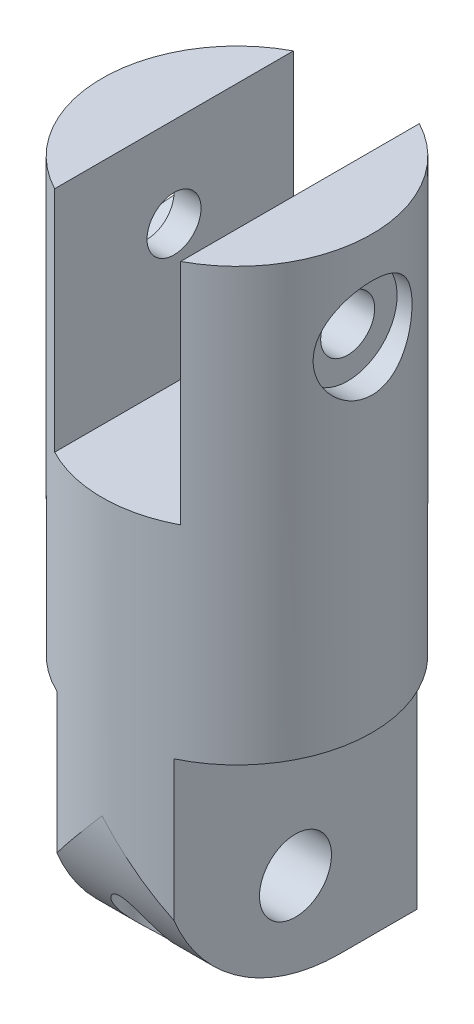
ISO-10303-21;
HEADER;
FILE_DESCRIPTION(('STEP AP214'),'2;1');
FILE_NAME('part.step','',(''),(''),'','','');
FILE_SCHEMA(('AUTOMOTIVE_DESIGN { 1 0 10303 214 1 1 1 1 }'));
ENDSEC;
DATA;
#1=APPLICATION_CONTEXT('core data for automotive mechanical design processes');
#2=APPLICATION_PROTOCOL_DEFINITION('international standard','automotive_design',2000,#1);
#3=PRODUCT_CONTEXT('',#1,'mechanical');
#4=PRODUCT('Part','Part','',(#3));
#5=PRODUCT_RELATED_PRODUCT_CATEGORY('part','',(#4));
#6=PRODUCT_DEFINITION_FORMATION('','',#4);
#7=PRODUCT_DEFINITION_CONTEXT('part definition',#1,'design');
#8=PRODUCT_DEFINITION('design','',#6,#7);
#9=PRODUCT_DEFINITION_SHAPE('','',#8);
#10=(LENGTH_UNIT() NAMED_UNIT(*) SI_UNIT(.MILLI.,.METRE.));
#11=(NAMED_UNIT(*) PLANE_ANGLE_UNIT() SI_UNIT($,.RADIAN.));
#12=(NAMED_UNIT(*) SI_UNIT($,.STERADIAN.) SOLID_ANGLE_UNIT());
#13=UNCERTAINTY_MEASURE_WITH_UNIT(LENGTH_MEASURE(1.E-05),#10,'distance_accuracy_value','');
#14=(GEOMETRIC_REPRESENTATION_CONTEXT(3) GLOBAL_UNCERTAINTY_ASSIGNED_CONTEXT((#13)) GLOBAL_UNIT_ASSIGNED_CONTEXT((#10,
#11,#12)) REPRESENTATION_CONTEXT('',''));
#15=CARTESIAN_POINT('',(0.,0.,0.));
#16=DIRECTION('',(0.,0.,1.));
#17=DIRECTION('',(1.,0.,0.));
#18=AXIS2_PLACEMENT_3D('',#15,#16,#17);
#19=CARTESIAN_POINT('',(3.25,7.,15.));
#20=DIRECTION('',(-1.,0.,0.));
#21=DIRECTION('',(0.,-1.,0.));
#22=AXIS2_PLACEMENT_3D('',#19,#20,#21);
#23=PLANE('',#22);
#24=CARTESIAN_POINT('',(3.25,-2.,7.5));
#25=DIRECTION('',(1.,0.,0.));
#26=DIRECTION('',(0.,1.,0.));
#27=AXIS2_PLACEMENT_3D('',#24,#25,#26);
#28=CIRCLE('',#27,2.);
#29=CARTESIAN_POINT('',(3.25,0.,7.5));
#30=VERTEX_POINT('',#29);
#31=EDGE_CURVE('E371',#30,#30,#28,.T.);
#32=ORIENTED_EDGE('',*,*,#31,.F.);
#33=EDGE_LOOP('',(#32));
#34=FACE_BOUND('',#33,.T.);
#35=DIRECTION('',(0.,1.,0.));
#36=VECTOR('',#35,1.);
#37=CARTESIAN_POINT('',(3.25,-7.,0.740747082702113));
#38=LINE('',#37,#36);
#39=CARTESIAN_POINT('',(3.25,-7.,0.740747082702113));
#40=VERTEX_POINT('',#39);
#41=CARTESIAN_POINT('',(3.25,7.,0.740747082702113));
#42=VERTEX_POINT('',#41);
#43=EDGE_CURVE('E242',#40,#42,#38,.T.);
#44=ORIENTED_EDGE('',*,*,#43,.T.);
#45=DIRECTION('',(0.,0.,-1.));
#46=VECTOR('',#45,1.);
#47=CARTESIAN_POINT('',(3.25,7.,15.));
#48=LINE('',#47,#46);
#49=CARTESIAN_POINT('',(3.25,7.,14.2592529172979));
#50=VERTEX_POINT('',#49);
#51=EDGE_CURVE('E389',#50,#42,#48,.T.);
#52=ORIENTED_EDGE('',*,*,#51,.F.);
#53=DIRECTION('',(0.,1.,0.));
#54=VECTOR('',#53,1.);
#55=CARTESIAN_POINT('',(3.25,-7.,14.2592529172979));
#56=LINE('',#55,#54);
#57=CARTESIAN_POINT('',(3.25,-0.777067038524808,14.2592529172979));
#58=VERTEX_POINT('',#57);
#59=EDGE_CURVE('E251',#58,#50,#56,.T.);
#60=ORIENTED_EDGE('',*,*,#59,.F.);
#61=CARTESIAN_POINT('',(3.25,3.,5.));
#62=DIRECTION('',(-1.,0.,0.));
#63=DIRECTION('',(0.,-1.,0.));
#64=AXIS2_PLACEMENT_3D('',#61,#62,#63);
#65=CIRCLE('',#64,10.);
#66=CARTESIAN_POINT('',(3.25,-7.,5.));
#67=VERTEX_POINT('',#66);
#68=EDGE_CURVE('E392',#58,#67,#65,.F.);
#69=ORIENTED_EDGE('',*,*,#68,.T.);
#70=DIRECTION('',(0.,0.,-1.));
#71=VECTOR('',#70,1.);
#72=CARTESIAN_POINT('',(3.25,-7.,15.));
#73=LINE('',#72,#71);
#74=EDGE_CURVE('E374',#67,#40,#73,.T.);
#75=ORIENTED_EDGE('',*,*,#74,.T.);
#76=EDGE_LOOP('',(#44,#52,#60,#69,#75));
#77=FACE_BOUND('',#76,.T.);
#78=ADVANCED_FACE('F70',(#34,#77),#23,.F.);
#79=CARTESIAN_POINT('',(-3.25,-7.,15.));
#80=DIRECTION('',(0.,1.,0.));
#81=DIRECTION('',(0.,0.,1.));
#82=AXIS2_PLACEMENT_3D('',#79,#80,#81);
#83=PLANE('',#82);
#84=CARTESIAN_POINT('',(0.,-7.,3.));
#85=DIRECTION('',(0.,-1.,0.));
#86=DIRECTION('',(0.,0.,-1.));
#87=AXIS2_PLACEMENT_3D('',#84,#85,#86);
#88=CIRCLE('',#87,1.25);
#89=CARTESIAN_POINT('',(0.,-7.,1.75));
#90=VERTEX_POINT('',#89);
#91=EDGE_CURVE('E213',#90,#90,#88,.T.);
#92=ORIENTED_EDGE('',*,*,#91,.F.);
#93=EDGE_LOOP('',(#92));
#94=FACE_BOUND('',#93,.T.);
#95=CARTESIAN_POINT('',(0.,-7.,7.5));
#96=DIRECTION('',(0.,1.,0.));
#97=DIRECTION('',(0.,0.,1.));
#98=AXIS2_PLACEMENT_3D('',#95,#96,#97);
#99=CIRCLE('',#98,7.5);
#100=CARTESIAN_POINT('',(-3.25,-7.,0.740747082702113));
#101=VERTEX_POINT('',#100);
#102=EDGE_CURVE('E252',#40,#101,#99,.T.);
#103=ORIENTED_EDGE('',*,*,#102,.F.);
#104=ORIENTED_EDGE('',*,*,#74,.F.);
#105=DIRECTION('',(1.,0.,0.));
#106=VECTOR('',#105,1.);
#107=CARTESIAN_POINT('',(-3.25,-7.,5.));
#108=LINE('',#107,#106);
#109=CARTESIAN_POINT('',(-3.25,-7.,5.));
#110=VERTEX_POINT('',#109);
#111=EDGE_CURVE('E394',#67,#110,#108,.F.);
#112=ORIENTED_EDGE('',*,*,#111,.T.);
#113=DIRECTION('',(0.,0.,-1.));
#114=VECTOR('',#113,1.);
#115=CARTESIAN_POINT('',(-3.25,-7.,15.));
#116=LINE('',#115,#114);
#117=EDGE_CURVE('E383',#110,#101,#116,.T.);
#118=ORIENTED_EDGE('',*,*,#117,.T.);
#119=EDGE_LOOP('',(#103,#104,#112,#118));
#120=FACE_BOUND('',#119,.T.);
#121=ADVANCED_FACE('F339',(#94,#120),#83,.F.);
#122=CARTESIAN_POINT('',(-3.25,7.,15.));
#123=DIRECTION('',(1.,0.,0.));
#124=DIRECTION('',(0.,1.,0.));
#125=AXIS2_PLACEMENT_3D('',#122,#123,#124);
#126=PLANE('',#125);
#127=CARTESIAN_POINT('',(-3.25,-2.,7.5));
#128=DIRECTION('',(1.,0.,0.));
#129=DIRECTION('',(0.,1.,0.));
#130=AXIS2_PLACEMENT_3D('',#127,#128,#129);
#131=CIRCLE('',#130,2.);
#132=CARTESIAN_POINT('',(-3.25,0.,7.5));
#133=VERTEX_POINT('',#132);
#134=EDGE_CURVE('E369',#133,#133,#131,.T.);
#135=ORIENTED_EDGE('',*,*,#134,.T.);
#136=EDGE_LOOP('',(#135));
#137=FACE_BOUND('',#136,.T.);
#138=CARTESIAN_POINT('',(-3.25,3.,5.));
#139=DIRECTION('',(1.,0.,0.));
#140=DIRECTION('',(0.,1.,0.));
#141=AXIS2_PLACEMENT_3D('',#138,#139,#140);
#142=CIRCLE('',#141,10.);
#143=CARTESIAN_POINT('',(-3.25,-0.777067038524727,14.2592529172979));
#144=VERTEX_POINT('',#143);
#145=EDGE_CURVE('E396',#110,#144,#142,.F.);
#146=ORIENTED_EDGE('',*,*,#145,.T.);
#147=DIRECTION('',(0.,1.,0.));
#148=VECTOR('',#147,1.);
#149=CARTESIAN_POINT('',(-3.25,-7.,14.2592529172979));
#150=LINE('',#149,#148);
#151=CARTESIAN_POINT('',(-3.25,7.,14.2592529172979));
#152=VERTEX_POINT('',#151);
#153=EDGE_CURVE('E240',#144,#152,#150,.T.);
#154=ORIENTED_EDGE('',*,*,#153,.T.);
#155=DIRECTION('',(0.,0.,-1.));
#156=VECTOR('',#155,1.);
#157=CARTESIAN_POINT('',(-3.25,7.,15.));
#158=LINE('',#157,#156);
#159=CARTESIAN_POINT('',(-3.25,7.,0.740747082702112));
#160=VERTEX_POINT('',#159);
#161=EDGE_CURVE('E386',#152,#160,#158,.T.);
#162=ORIENTED_EDGE('',*,*,#161,.T.);
#163=DIRECTION('',(0.,1.,0.));
#164=VECTOR('',#163,1.);
#165=CARTESIAN_POINT('',(-3.25,-7.,0.740747082702113));
#166=LINE('',#165,#164);
#167=EDGE_CURVE('E422',#101,#160,#166,.T.);
#168=ORIENTED_EDGE('',*,*,#167,.F.);
#169=ORIENTED_EDGE('',*,*,#117,.F.);
#170=EDGE_LOOP('',(#146,#154,#162,#168,#169));
#171=FACE_BOUND('',#170,.T.);
#172=ADVANCED_FACE('F344',(#137,#171),#126,.F.);
#173=CARTESIAN_POINT('',(0.,3.,5.));
#174=DIRECTION('',(-1.,0.,0.));
#175=DIRECTION('',(0.,0.,1.));
#176=AXIS2_PLACEMENT_3D('',#173,#174,#175);
#177=CYLINDRICAL_SURFACE('',#176,10.);
#178=CARTESIAN_POINT('',(0.,-4.60034588039679,11.4988262400479));
#179=CARTESIAN_POINT('',(0.0575288109608131,-4.60034633192946,11.4988256093035));
#180=CARTESIAN_POINT('',(0.11505399772144,-4.59693401826059,11.502822715136));
#181=CARTESIAN_POINT('',(0.22823665096081,-4.5834761227697,11.5185116248287));
#182=CARTESIAN_POINT('',(0.283893883210376,-4.57342971231711,11.5302043899131));
#183=CARTESIAN_POINT('',(0.391522903078539,-4.54727481070758,11.560414189299));
#184=CARTESIAN_POINT('',(0.443509328590721,-4.53119222670741,11.578902052222));
#185=CARTESIAN_POINT('',(0.542970946334787,-4.49367037095389,11.6216094500825));
#186=CARTESIAN_POINT('',(0.590444207603541,-4.47222882047104,11.6458314230352));
#187=CARTESIAN_POINT('',(0.693858382566063,-4.41754856445222,11.7068701017729));
#188=CARTESIAN_POINT('',(0.74800982895763,-4.38270365386441,11.7452795553846));
#189=CARTESIAN_POINT('',(0.847148183723735,-4.30681705487514,11.8274129335695));
#190=CARTESIAN_POINT('',(0.89211987702798,-4.26576527170702,11.8711454925512));
#191=CARTESIAN_POINT('',(0.987252420045894,-4.16367094789748,11.9777470851912));
#192=CARTESIAN_POINT('',(1.03375682534324,-4.10064843319519,12.0419724818224));
#193=CARTESIAN_POINT('',(1.11202550102491,-3.96841120618138,12.1728634669199));
#194=CARTESIAN_POINT('',(1.14376846925352,-3.89918771589937,12.2395324330415));
#195=CARTESIAN_POINT('',(1.20512691121574,-3.72575254744175,12.4015979723462));
#196=CARTESIAN_POINT('',(1.22801220853734,-3.61925054145639,12.4970726247963));
#197=CARTESIAN_POINT('',(1.25192625827192,-3.40072630611675,12.6845018482235));
#198=CARTESIAN_POINT('',(1.25290080853041,-3.28869107409675,12.7764471281507));
#199=CARTESIAN_POINT('',(1.2390160739484,-3.10025953801128,12.9243894094759));
#200=CARTESIAN_POINT('',(1.22941770428853,-3.02467078036612,12.9819973062648));
#201=CARTESIAN_POINT('',(1.20265869273446,-2.87271614168859,13.0944508219831));
#202=CARTESIAN_POINT('',(1.18549447992938,-2.79634991035228,13.1492951229198));
#203=CARTESIAN_POINT('',(1.14397630217485,-2.64352762751517,13.2558626611615));
#204=CARTESIAN_POINT('',(1.1196297934206,-2.56707175066068,13.3075890685247));
#205=CARTESIAN_POINT('',(1.0637867813495,-2.4146576671145,13.4077218470943));
#206=CARTESIAN_POINT('',(1.03229458006037,-2.33869918916016,13.4561301931831));
#207=CARTESIAN_POINT('',(0.959546911817907,-2.18327021358453,13.5523439188718));
#208=CARTESIAN_POINT('',(0.917797461428203,-2.10388405447856,13.5999146411363));
#209=CARTESIAN_POINT('',(0.824662482152894,-1.94813724713139,13.6904545809013));
#210=CARTESIAN_POINT('',(0.773285416874435,-1.87177401232619,13.7334277883316));
#211=CARTESIAN_POINT('',(0.676695759717014,-1.74841146843393,13.8009016608124));
#212=CARTESIAN_POINT('',(0.634678644034613,-1.69976793648386,13.8269441706631));
#213=CARTESIAN_POINT('',(0.543764619578198,-1.60733393640184,13.8755374312719));
#214=CARTESIAN_POINT('',(0.494882481116181,-1.56353340082824,13.8980954657454));
#215=CARTESIAN_POINT('',(0.410328609425263,-1.50057299344001,13.9300362657961));
#216=CARTESIAN_POINT('',(0.377364323238513,-1.47863442485303,13.9410472218018));
#217=CARTESIAN_POINT('',(0.308269866690451,-1.43908401630296,13.9607487164632));
#218=CARTESIAN_POINT('',(0.272144496533989,-1.42146576535685,13.9694426950006));
#219=CARTESIAN_POINT('',(0.204140015054733,-1.39500732552652,13.9824321515032));
#220=CARTESIAN_POINT('',(0.172770922493601,-1.38513258262856,13.9872509335304));
#221=CARTESIAN_POINT('',(0.10863906512088,-1.3702186469195,13.9945127413908));
#222=CARTESIAN_POINT('',(0.0758780804831299,-1.36517346082817,13.9969587118357));
#223=CARTESIAN_POINT('',(0.00971565662024547,-1.36049332526411,13.999228082882));
#224=CARTESIAN_POINT('',(-0.0236880276005255,-1.36088324321488,13.9990394291871));
#225=CARTESIAN_POINT('',(-0.0898697850396133,-1.36708221585887,13.9960326446625));
#226=CARTESIAN_POINT('',(-0.12264736944618,-1.37289534121178,13.9932125386644));
#227=CARTESIAN_POINT('',(-0.192498993484608,-1.39076317365085,13.9845039818664));
#228=CARTESIAN_POINT('',(-0.229268404492208,-1.40376175841571,13.9781502759771));
#229=CARTESIAN_POINT('',(-0.299995279155415,-1.43484740134685,13.9628359879126));
#230=CARTESIAN_POINT('',(-0.333946810007977,-1.45294485968761,13.9538700763329));
#231=CARTESIAN_POINT('',(-0.418925600500643,-1.50503533887645,13.9278178923304));
#232=CARTESIAN_POINT('',(-0.467632638347218,-1.54196424707584,13.909126433341));
#233=CARTESIAN_POINT('',(-0.558564300251688,-1.62136560507975,13.8682014347293));
#234=CARTESIAN_POINT('',(-0.600770050090257,-1.66385355695524,13.8459579501095));
#235=CARTESIAN_POINT('',(-0.678801636651221,-1.75107385940053,13.799413769684));
#236=CARTESIAN_POINT('',(-0.714760353406768,-1.79572378952148,13.7751782289425));
#237=CARTESIAN_POINT('',(-0.782368998157438,-1.88709197799037,13.724624021988));
#238=CARTESIAN_POINT('',(-0.814015009233281,-1.93381206615915,13.6983034959845));
#239=CARTESIAN_POINT('',(-0.873578262146656,-2.02867607236967,13.6438079702081));
#240=CARTESIAN_POINT('',(-0.901487844310031,-2.07682267540891,13.6156293325072));
#241=CARTESIAN_POINT('',(-0.953869165706419,-2.17399414365024,13.5576276254842));
#242=CARTESIAN_POINT('',(-0.978339944562463,-2.22301924990456,13.5278041000089));
#243=CARTESIAN_POINT('',(-1.03648457622005,-2.34837571239289,13.4500224067966));
#244=CARTESIAN_POINT('',(-1.06794492165718,-2.42508593896396,13.4010069487532));
#245=CARTESIAN_POINT('',(-1.12359720816828,-2.57896430130894,13.2996181391025));
#246=CARTESIAN_POINT('',(-1.14778503835172,-2.65613267101885,13.2472429085551));
#247=CARTESIAN_POINT('',(-1.18880186967856,-2.81020378415608,13.1394324196061));
#248=CARTESIAN_POINT('',(-1.2056368062501,-2.8871066919307,13.0839996701717));
#249=CARTESIAN_POINT('',(-1.23159320381571,-3.04008538662955,12.970348311449));
#250=CARTESIAN_POINT('',(-1.2407185329799,-3.11616156941276,12.912131114723));
#251=CARTESIAN_POINT('',(-1.25286792344638,-3.30085753472534,12.766499936122));
#252=CARTESIAN_POINT('',(-1.2513126972625,-3.40875200184953,12.6777134732531));
#253=CARTESIAN_POINT('',(-1.22772366104796,-3.61938148403095,12.4968619169247));
#254=CARTESIAN_POINT('',(-1.20573097558767,-3.72212642360836,12.4048037644697));
#255=CARTESIAN_POINT('',(-1.14743386723128,-3.8900628974733,12.2481774324844));
#256=CARTESIAN_POINT('',(-1.11731814138053,-3.95734634387134,12.1835632594184));
#257=CARTESIAN_POINT('',(-1.04332667285176,-4.0862124112587,12.0564668539613));
#258=CARTESIAN_POINT('',(-0.999468461074937,-4.14780216661484,11.9939820172111));
#259=CARTESIAN_POINT('',(-0.908823343821531,-4.24931724766382,11.8885005866831));
#260=CARTESIAN_POINT('',(-0.865205843162854,-4.2909138401453,11.8444000545688));
#261=CARTESIAN_POINT('',(-0.76883757221327,-4.36814251288804,11.7611894906291));
#262=CARTESIAN_POINT('',(-0.716098431613276,-4.40378207569116,11.7220732130628));
#263=CARTESIAN_POINT('',(-0.612245124736067,-4.46172352984542,11.657643266576));
#264=CARTESIAN_POINT('',(-0.562586109481275,-4.48527243298603,11.6311133106998));
#265=CARTESIAN_POINT('',(-0.458065299417217,-4.52641813587298,11.584375566612));
#266=CARTESIAN_POINT('',(-0.403206475147318,-4.54401830807232,11.5641641967587));
#267=CARTESIAN_POINT('',(-0.291201637526191,-4.57200141151039,11.5318637455773));
#268=CARTESIAN_POINT('',(-0.234168560095787,-4.58257937423715,11.5195555175503));
#269=CARTESIAN_POINT('',(-0.118088610350123,-4.59675024599106,11.5030383998551));
#270=CARTESIAN_POINT('',(-0.0590423964677331,-4.60034541698428,11.4988268873873));
#271=CARTESIAN_POINT('',(0.,-4.60034588039679,11.4988262400479));
#272=B_SPLINE_CURVE_WITH_KNOTS('',3,(#178,#179,#180,#181,#182,#183,#184,#185,#186,#187,#188,
#189,#190,#191,#192,#193,#194,#195,#196,#197,#198,#199,#200,#201,#202,#203,#204,#205,#206,#207,
#208,#209,#210,#211,#212,#213,#214,#215,#216,#217,#218,#219,#220,#221,#222,#223,#224,#225,#226,
#227,#228,#229,#230,#231,#232,#233,#234,#235,#236,#237,#238,#239,#240,#241,#242,#243,#244,#245,
#246,#247,#248,#249,#250,#251,#252,#253,#254,#255,#256,#257,#258,#259,#260,#261,#262,#263,#264,
#265,#266,#267,#268,#269,#270,#271),.UNSPECIFIED.,.T.,.F.,(4,2,2,2,2,2,2,2,2,2,2,2,2,2,2,2,2,2,
2,2,2,2,2,2,2,2,2,2,2,2,2,2,2,2,2,2,2,2,2,2,2,2,2,2,2,2,4),(0.,0.172348273756097,
0.344718078712481,0.516356381687259,0.688067792913604,0.911779782670741,1.13585960792365,
1.43805653794473,1.74068822377861,2.17289589147549,2.60617262432262,2.89241887086686,
3.17880036422053,3.46488559482381,3.75079904413221,4.05491767460736,4.35877019896172,
4.56645367834022,4.77369697735467,4.89669523302743,5.0195098500147,5.11882624455042,
5.21801923115933,5.31766620732977,5.41738803875374,5.53527045520422,5.65339507916606,
5.84407282185146,6.03529410095019,6.22174555510802,6.40836523689131,6.59536181455266,
6.78241051261683,7.07097917352888,7.35971064655029,7.64820861604563,7.93656175026965,
8.35438832069885,8.77137595038052,9.06454630970578,9.35734419210841,9.58060303576063,
9.80357930464446,9.98592361306855,10.1681643728299,10.3451044636672,10.5219872279666),.UNSPECIFIED.);
#273=CARTESIAN_POINT('',(0.,-4.60034588039679,11.4988262400479));
#274=VERTEX_POINT('',#273);
#275=EDGE_CURVE('E75',#274,#274,#272,.T.);
#276=ORIENTED_EDGE('',*,*,#275,.F.);
#277=EDGE_LOOP('',(#276));
#278=FACE_BOUND('',#277,.T.);
#279=CARTESIAN_POINT('',(-3.25,-0.777067038524808,14.2592529172979));
#280=CARTESIAN_POINT('',(-3.11964803441231,-0.623422022657622,14.3219224333858));
#281=CARTESIAN_POINT('',(-2.98826751006328,-0.469006401054278,14.3804577255213));
#282=CARTESIAN_POINT('',(-2.7237404145902,-0.158847919875885,14.4894004376096));
#283=CARTESIAN_POINT('',(-2.59059398915032,-0.00310517016124126,14.539808523586));
#284=CARTESIAN_POINT('',(-2.1888915842863,0.46585242207751,14.6790735815163));
#285=CARTESIAN_POINT('',(-1.91809052694975,0.78077536711749,14.7559627524007));
#286=CARTESIAN_POINT('',(-1.37572389886744,1.4099863558356,14.8779292423823));
#287=CARTESIAN_POINT('',(-1.10419730090432,1.72424533420997,14.9233371711216));
#288=CARTESIAN_POINT('',(-0.5594483269617,2.35399928323636,14.984120133363));
#289=CARTESIAN_POINT('',(-0.286226977240884,2.66949346995055,14.9995118431247));
#290=CARTESIAN_POINT('',(-0.00872869143398145,2.9899209752028,14.9999961890182));
#291=CARTESIAN_POINT('',(-0.00436433249316354,2.9949605028181,14.9999999984407));
#292=CARTESIAN_POINT('',(0.,3.,15.));
#293=B_SPLINE_CURVE_WITH_KNOTS('',3,(#279,#280,#281,#282,#283,#284,#285,#286,#287,#288,#289,
#290,#291,#292),.UNSPECIFIED.,.F.,.F.,(4,2,2,2,2,2,4),(0.,0.632933239584302,1.26581458397719,
2.53166454368447,3.78401078214235,5.03566104994836,5.05566105321367),.UNSPECIFIED.);
#294=CARTESIAN_POINT('',(0.,3.,15.));
#295=VERTEX_POINT('',#294);
#296=EDGE_CURVE('E244',#144,#295,#293,.T.);
#297=ORIENTED_EDGE('',*,*,#296,.F.);
#298=ORIENTED_EDGE('',*,*,#145,.F.);
#299=ORIENTED_EDGE('',*,*,#111,.F.);
#300=ORIENTED_EDGE('',*,*,#68,.F.);
#301=CARTESIAN_POINT('',(3.25,-0.777067038524808,14.2592529172979));
#302=CARTESIAN_POINT('',(3.11964803441233,-0.623422022657608,14.3219224333858));
#303=CARTESIAN_POINT('',(2.9882675100633,-0.469006401054276,14.3804577255213));
#304=CARTESIAN_POINT('',(2.7237404145902,-0.158847919875907,14.4894004376096));
#305=CARTESIAN_POINT('',(2.59059398915031,-0.00310517016127368,14.539808523586));
#306=CARTESIAN_POINT('',(2.18889158428635,0.465852422077542,14.6790735815163));
#307=CARTESIAN_POINT('',(1.91809052694998,0.780775367117685,14.7559627524007));
#308=CARTESIAN_POINT('',(1.37572389886721,1.40998635583541,14.8779292423823));
#309=CARTESIAN_POINT('',(1.10419730090346,1.72424533420923,14.9233371711216));
#310=CARTESIAN_POINT('',(0.559448326962563,2.35399928323711,14.984120133363));
#311=CARTESIAN_POINT('',(0.286226977244101,2.66949346995334,14.9995118431247));
#312=CARTESIAN_POINT('',(0.00872869143408389,2.98992097520289,14.9999961890182));
#313=CARTESIAN_POINT('',(0.00436433249321547,2.99496050281815,14.9999999984407));
#314=CARTESIAN_POINT('',(0.,3.,15.));
#315=B_SPLINE_CURVE_WITH_KNOTS('',3,(#301,#302,#303,#304,#305,#306,#307,#308,#309,#310,#311,
#312,#313,#314),.UNSPECIFIED.,.F.,.F.,(4,2,2,2,2,2,4),(0.,0.632933239584291,1.26581458397717,
2.53166454368448,3.78401078214236,5.03566104994837,5.05566105321368),.UNSPECIFIED.);
#316=EDGE_CURVE('E264',#58,#295,#315,.T.);
#317=ORIENTED_EDGE('',*,*,#316,.T.);
#318=EDGE_LOOP('',(#297,#298,#299,#300,#317));
#319=FACE_BOUND('',#318,.T.);
#320=ADVANCED_FACE('F72',(#278,#319),#177,.T.);
#321=CARTESIAN_POINT('',(0.,31.,7.5));
#322=DIRECTION('',(0.,1.,0.));
#323=DIRECTION('',(0.,0.,1.));
#324=AXIS2_PLACEMENT_3D('',#321,#322,#323);
#325=PLANE('',#324);
#326=DIRECTION('',(0.,0.,1.));
#327=VECTOR('',#326,1.);
#328=CARTESIAN_POINT('',(-3.50000000000002,31.,7.5));
#329=LINE('',#328,#327);
#330=CARTESIAN_POINT('',(-3.50000000000002,31.,0.866750419289207));
#331=VERTEX_POINT('',#330);
#332=CARTESIAN_POINT('',(-3.50000000000002,31.,14.1332495807108));
#333=VERTEX_POINT('',#332);
#334=EDGE_CURVE('E400',#331,#333,#329,.T.);
#335=ORIENTED_EDGE('',*,*,#334,.F.);
#336=CARTESIAN_POINT('',(0.,31.,7.5));
#337=DIRECTION('',(0.,1.,0.));
#338=DIRECTION('',(0.,0.,1.));
#339=AXIS2_PLACEMENT_3D('',#336,#337,#338);
#340=CIRCLE('',#339,7.5);
#341=EDGE_CURVE('E377',#331,#333,#340,.T.);
#342=ORIENTED_EDGE('',*,*,#341,.T.);
#343=EDGE_LOOP('',(#335,#342));
#344=FACE_BOUND('',#343,.T.);
#345=ADVANCED_FACE('F355',(#344),#325,.T.);
#346=CARTESIAN_POINT('',(-3.25,-2.,7.5));
#347=DIRECTION('',(1.,0.,0.));
#348=DIRECTION('',(0.,1.,0.));
#349=AXIS2_PLACEMENT_3D('',#346,#347,#348);
#350=CYLINDRICAL_SURFACE('',#349,2.);
#351=ORIENTED_EDGE('',*,*,#134,.F.);
#352=EDGE_LOOP('',(#351));
#353=FACE_BOUND('',#352,.T.);
#354=ORIENTED_EDGE('',*,*,#31,.T.);
#355=EDGE_LOOP('',(#354));
#356=FACE_BOUND('',#355,.T.);
#357=ADVANCED_FACE('F352',(#353,#356),#350,.F.);
#358=CARTESIAN_POINT('',(0.,7.,7.5));
#359=DIRECTION('',(0.,1.,0.));
#360=DIRECTION('',(0.,0.,1.));
#361=AXIS2_PLACEMENT_3D('',#358,#359,#360);
#362=PLANE('',#361);
#363=CARTESIAN_POINT('',(0.,7.,7.5));
#364=DIRECTION('',(0.,1.,0.));
#365=DIRECTION('',(0.,0.,1.));
#366=AXIS2_PLACEMENT_3D('',#363,#364,#365);
#367=CIRCLE('',#366,7.5);
#368=EDGE_CURVE('E432',#50,#42,#367,.T.);
#369=ORIENTED_EDGE('',*,*,#368,.F.);
#370=ORIENTED_EDGE('',*,*,#51,.T.);
#371=EDGE_LOOP('',(#369,#370));
#372=FACE_BOUND('',#371,.T.);
#373=ADVANCED_FACE('F354',(#372),#362,.F.);
#374=CARTESIAN_POINT('',(0.,31.,7.5));
#375=DIRECTION('',(0.,-1.,0.));
#376=DIRECTION('',(0.,0.,-1.));
#377=AXIS2_PLACEMENT_3D('',#374,#375,#376);
#378=CYLINDRICAL_SURFACE('',#377,7.5);
#379=DIRECTION('',(0.,-1.,0.));
#380=VECTOR('',#379,1.);
#381=CARTESIAN_POINT('',(-6.75925291729789,31.,4.25));
#382=LINE('',#381,#380);
#383=CARTESIAN_POINT('',(-6.7592529172979,24.1236116251337,4.25000000000001));
#384=VERTEX_POINT('',#383);
#385=CARTESIAN_POINT('',(-6.75925291729789,27.8763883748663,4.25000000000001));
#386=VERTEX_POINT('',#385);
#387=EDGE_CURVE('E83',#384,#386,#382,.F.);
#388=ORIENTED_EDGE('',*,*,#387,.T.);
#389=CARTESIAN_POINT('',(0.,29.7527767497326,7.5));
#390=DIRECTION('',(0.,0.866025403784439,-0.5));
#391=DIRECTION('',(0.,-0.5,-0.866025403784439));
#392=AXIS2_PLACEMENT_3D('',#389,#390,#391);
#393=ELLIPSE('',#392,8.66025403784439,7.5);
#394=CARTESIAN_POINT('',(-7.5,29.7527767497326,7.5));
#395=VERTEX_POINT('',#394);
#396=EDGE_CURVE('E12',#386,#395,#393,.T.);
#397=ORIENTED_EDGE('',*,*,#396,.T.);
#398=CARTESIAN_POINT('',(0.,29.7527767497326,7.5));
#399=DIRECTION('',(0.,0.866025403784439,0.5));
#400=DIRECTION('',(0.,-0.5,0.866025403784439));
#401=AXIS2_PLACEMENT_3D('',#398,#399,#400);
#402=ELLIPSE('',#401,8.66025403784439,7.5);
#403=CARTESIAN_POINT('',(-6.75925291729789,27.8763883748663,10.75));
#404=VERTEX_POINT('',#403);
#405=EDGE_CURVE('E189',#395,#404,#402,.T.);
#406=ORIENTED_EDGE('',*,*,#405,.T.);
#407=DIRECTION('',(0.,-1.,0.));
#408=VECTOR('',#407,1.);
#409=CARTESIAN_POINT('',(-6.75925291729789,31.,10.75));
#410=LINE('',#409,#408);
#411=CARTESIAN_POINT('',(-6.75925291729789,24.1236116251337,10.75));
#412=VERTEX_POINT('',#411);
#413=EDGE_CURVE('E669',#404,#412,#410,.T.);
#414=ORIENTED_EDGE('',*,*,#413,.T.);
#415=CARTESIAN_POINT('',(0.,22.2472232502674,7.5));
#416=DIRECTION('',(0.,-0.866025403784438,0.500000000000001));
#417=DIRECTION('',(0.,-0.500000000000001,-0.866025403784438));
#418=AXIS2_PLACEMENT_3D('',#415,#416,#417);
#419=ELLIPSE('',#418,8.66025403784439,7.5);
#420=CARTESIAN_POINT('',(-7.5,22.2472232502674,7.50000000000001));
#421=VERTEX_POINT('',#420);
#422=EDGE_CURVE('E665',#412,#421,#419,.T.);
#423=ORIENTED_EDGE('',*,*,#422,.T.);
#424=CARTESIAN_POINT('',(0.,22.2472232502674,7.5));
#425=DIRECTION('',(0.,-0.866025403784439,-0.499999999999999));
#426=DIRECTION('',(0.,-0.499999999999999,0.866025403784439));
#427=AXIS2_PLACEMENT_3D('',#424,#425,#426);
#428=ELLIPSE('',#427,8.66025403784438,7.5);
#429=EDGE_CURVE('E662',#421,#384,#428,.T.);
#430=ORIENTED_EDGE('',*,*,#429,.T.);
#431=EDGE_LOOP('',(#388,#397,#406,#414,#423,#430));
#432=FACE_BOUND('',#431,.T.);
#433=CARTESIAN_POINT('',(7.5,23.25,7.5));
#434=CARTESIAN_POINT('',(7.50000312186943,23.2499957601559,7.64916340091462));
#435=CARTESIAN_POINT('',(7.49551083407196,23.2621745142851,7.79829715261848));
#436=CARTESIAN_POINT('',(7.47803771691331,23.3103807639427,8.09212061063863));
#437=CARTESIAN_POINT('',(7.46505769251259,23.3464059979212,8.23681073701748));
#438=CARTESIAN_POINT('',(7.43200599882739,23.4408685459559,8.51746784637522));
#439=CARTESIAN_POINT('',(7.41194764249896,23.4992638038986,8.65345064275875));
#440=CARTESIAN_POINT('',(7.36674725461798,23.6365998026205,8.91368339201445));
#441=CARTESIAN_POINT('',(7.34160392586796,23.7155457874537,9.03793033913379));
#442=CARTESIAN_POINT('',(7.28769120419502,23.8951165871431,9.2762429222357));
#443=CARTESIAN_POINT('',(7.25882233991119,23.9964330069993,9.38976472910907));
#444=CARTESIAN_POINT('',(7.20121334184221,24.2164002540435,9.59863947514447));
#445=CARTESIAN_POINT('',(7.17247324728629,24.335056036644,9.69398720232952));
#446=CARTESIAN_POINT('',(7.11723192199314,24.5915596285549,9.86719005872891));
#447=CARTESIAN_POINT('',(7.09084889561058,24.7299454567554,9.94428985961203));
#448=CARTESIAN_POINT('',(7.04484932142569,25.0188406266334,10.0738807153727));
#449=CARTESIAN_POINT('',(7.02523020673632,25.1693453424172,10.126381108384));
#450=CARTESIAN_POINT('',(6.99603990329749,25.4719588814006,10.2031578776842));
#451=CARTESIAN_POINT('',(6.98610194555094,25.6237687440343,10.2284685676662));
#452=CARTESIAN_POINT('',(6.97632326042149,25.9297811892959,10.2533816996786));
#453=CARTESIAN_POINT('',(6.97647859485257,26.0839828152304,10.2529941686023));
#454=CARTESIAN_POINT('',(6.98655161563675,26.3810789225906,10.2273152463416));
#455=CARTESIAN_POINT('',(6.99591416236741,26.5241180714193,10.2034399938661));
#456=CARTESIAN_POINT('',(7.02242705549906,26.8039973045031,10.1337980138));
#457=CARTESIAN_POINT('',(7.03957852258203,26.9408364935813,10.088028135926));
#458=CARTESIAN_POINT('',(7.08008337610026,27.2073857915592,9.97508832183277));
#459=CARTESIAN_POINT('',(7.10354498086313,27.3369185940038,9.90754043957437));
#460=CARTESIAN_POINT('',(7.15398860670264,27.5832293506763,9.75322516181072));
#461=CARTESIAN_POINT('',(7.18097180350953,27.7000030210703,9.66645134069005));
#462=CARTESIAN_POINT('',(7.23752687525343,27.9253454837079,9.46960155284458));
#463=CARTESIAN_POINT('',(7.26715387777086,28.032910199767,9.35838932735392));
#464=CARTESIAN_POINT('',(7.32416772152515,28.2281537541427,9.11915779399269));
#465=CARTESIAN_POINT('',(7.3515542477326,28.3158297990106,8.99113612914646));
#466=CARTESIAN_POINT('',(7.40150404263882,28.469849921192,8.71944943250202));
#467=CARTESIAN_POINT('',(7.42399328235867,28.5358733353786,8.57558804380358));
#468=CARTESIAN_POINT('',(7.46106828194135,28.6424524315738,8.27777168193606));
#469=CARTESIAN_POINT('',(7.47565739110895,28.6830189073552,8.12382101725383));
#470=CARTESIAN_POINT('',(7.49470661210037,28.7356341007007,7.81865715690413));
#471=CARTESIAN_POINT('',(7.49964681722227,28.7490358318725,7.66770697278252));
#472=CARTESIAN_POINT('',(7.50031608885126,28.7508630018728,7.36565203255629));
#473=CARTESIAN_POINT('',(7.49604709187873,28.7392936916369,7.21454731562548));
#474=CARTESIAN_POINT('',(7.47909471176213,28.6925452079771,6.92222898460096));
#475=CARTESIAN_POINT('',(7.46672323625137,28.6582406720003,6.78085553796851));
#476=CARTESIAN_POINT('',(7.43512235809386,28.5681349472647,6.50596090832168));
#477=CARTESIAN_POINT('',(7.41589206317618,28.5123309615443,6.37244074958353));
#478=CARTESIAN_POINT('',(7.3717934654489,28.3790539116285,6.11272893005816));
#479=CARTESIAN_POINT('',(7.34677844528394,28.301001869951,5.98686004951381));
#480=CARTESIAN_POINT('',(7.29389308718916,28.1261036082178,5.74959324541106));
#481=CARTESIAN_POINT('',(7.26602173076095,28.0292506731475,5.63820051602461));
#482=CARTESIAN_POINT('',(7.20858443222809,27.813177374235,5.42659777286201));
#483=CARTESIAN_POINT('',(7.17901017230758,27.6930149402375,5.32734951094925));
#484=CARTESIAN_POINT('',(7.12301420495134,27.4371450050785,5.15025082554627));
#485=CARTESIAN_POINT('',(7.09659271654603,27.3014364251721,5.0724018882281));
#486=CARTESIAN_POINT('',(7.05004267507774,27.0174626284658,4.94034362890839));
#487=CARTESIAN_POINT('',(7.02993081583834,26.8691653988561,4.88619687043256));
#488=CARTESIAN_POINT('',(6.99881623412452,26.564621151899,4.80397675168701));
#489=CARTESIAN_POINT('',(6.98780821140261,26.4083788165147,4.77588821917411));
#490=CARTESIAN_POINT('',(6.97683139543634,26.1027486399612,4.74790483037546));
#491=CARTESIAN_POINT('',(6.97622414135253,25.9535317080346,4.74637927832575));
#492=CARTESIAN_POINT('',(6.98449276936025,25.6570884497829,4.76742136880885));
#493=CARTESIAN_POINT('',(6.99336783146823,25.5098619524497,4.789986928062));
#494=CARTESIAN_POINT('',(7.01908063198066,25.225730914034,4.85732302895733));
#495=CARTESIAN_POINT('',(7.03568945153918,25.0886530299248,4.90145689764079));
#496=CARTESIAN_POINT('',(7.0748745278557,24.8237608470382,5.01012643456598));
#497=CARTESIAN_POINT('',(7.09745226019147,24.695948848854,5.07466714836784));
#498=CARTESIAN_POINT('',(7.14745651289183,24.446173516875,5.22612146257841));
#499=CARTESIAN_POINT('',(7.17507087475862,24.3248355716804,5.31400373788159));
#500=CARTESIAN_POINT('',(7.23136315938062,24.0981067555171,5.50811900047636));
#501=CARTESIAN_POINT('',(7.26004141030265,23.9927208569003,5.61435768756782));
#502=CARTESIAN_POINT('',(7.31698041886032,23.7954400202964,5.84862840053256));
#503=CARTESIAN_POINT('',(7.34514593066589,23.7045025963147,5.97749345971985));
#504=CARTESIAN_POINT('',(7.39633669940812,23.5456226545033,6.24965784854994));
#505=CARTESIAN_POINT('',(7.41936193536523,23.4776802305249,6.39295723710164));
#506=CARTESIAN_POINT('',(7.45811714803401,23.3658300233738,6.69376598407588));
#507=CARTESIAN_POINT('',(7.4736521370045,23.3225597743705,6.85153953395494));
#508=CARTESIAN_POINT('',(7.49458959004745,23.2646534781244,7.17288901781912));
#509=CARTESIAN_POINT('',(7.4999965772887,23.2500046484207,7.336462328356));
#510=CARTESIAN_POINT('',(7.5,23.25,7.5));
#511=B_SPLINE_CURVE_WITH_KNOTS('',3,(#433,#434,#435,#436,#437,#438,#439,#440,#441,#442,#443,
#444,#445,#446,#447,#448,#449,#450,#451,#452,#453,#454,#455,#456,#457,#458,#459,#460,#461,#462,
#463,#464,#465,#466,#467,#468,#469,#470,#471,#472,#473,#474,#475,#476,#477,#478,#479,#480,#481,
#482,#483,#484,#485,#486,#487,#488,#489,#490,#491,#492,#493,#494,#495,#496,#497,#498,#499,#500,
#501,#502,#503,#504,#505,#506,#507,#508,#509,#510),.UNSPECIFIED.,.T.,.F.,(4,2,2,2,2,2,2,2,2,2,2,
2,2,2,2,2,2,2,2,2,2,2,2,2,2,2,2,2,2,2,2,2,2,2,2,2,2,2,4),(0.,0.446887269349349,0.89373216292337,
1.33974106914939,1.7858638979375,2.24842473965862,2.71111803601497,3.19050672893151,
3.66971329430219,4.12996375453753,4.5900346359978,5.0239670519462,5.45796192255757,
5.89993527296308,6.34205656133036,6.81248619551746,7.28298186270095,7.76015995462979,
8.23713558552158,8.68970480563611,9.14217886831115,9.57818454876606,10.0142469703521,
10.4628962097749,10.9117059866708,11.385386450699,11.8590998032843,12.3340561236824,
12.80873572978,13.254164536792,13.6995548284527,14.13252653843,14.5656053837986,15.020648736522,
15.4758336382825,15.9541458857871,16.4324600854427,16.9226310274791,17.4125830067758),.UNSPECIFIED.);
#512=CARTESIAN_POINT('',(7.5,23.25,7.5));
#513=VERTEX_POINT('',#512);
#514=EDGE_CURVE('E276',#513,#513,#511,.T.);
#515=ORIENTED_EDGE('',*,*,#514,.T.);
#516=EDGE_LOOP('',(#515));
#517=FACE_BOUND('',#516,.T.);
#518=DIRECTION('',(0.,-1.,0.));
#519=VECTOR('',#518,1.);
#520=CARTESIAN_POINT('',(3.50000000000002,31.,14.1332495807108));
#521=LINE('',#520,#519);
#522=CARTESIAN_POINT('',(3.50000000000002,31.,14.1332495807108));
#523=VERTEX_POINT('',#522);
#524=CARTESIAN_POINT('',(3.49999999999998,18.32,14.1332495807108));
#525=VERTEX_POINT('',#524);
#526=EDGE_CURVE('E98',#523,#525,#521,.T.);
#527=ORIENTED_EDGE('',*,*,#526,.T.);
#528=CARTESIAN_POINT('',(0.,18.32,7.5));
#529=DIRECTION('',(0.,-1.,0.));
#530=DIRECTION('',(0.,0.,-1.));
#531=AXIS2_PLACEMENT_3D('',#528,#529,#530);
#532=CIRCLE('',#531,7.5);
#533=CARTESIAN_POINT('',(-3.50000000000002,18.32,14.1332495807108));
#534=VERTEX_POINT('',#533);
#535=EDGE_CURVE('E271',#525,#534,#532,.T.);
#536=ORIENTED_EDGE('',*,*,#535,.T.);
#537=DIRECTION('',(0.,-1.,0.));
#538=VECTOR('',#537,1.);
#539=CARTESIAN_POINT('',(-3.50000000000002,31.,14.1332495807108));
#540=LINE('',#539,#538);
#541=EDGE_CURVE('E411',#534,#333,#540,.F.);
#542=ORIENTED_EDGE('',*,*,#541,.T.);
#543=ORIENTED_EDGE('',*,*,#341,.F.);
#544=DIRECTION('',(0.,-1.,0.));
#545=VECTOR('',#544,1.);
#546=CARTESIAN_POINT('',(-3.50000000000002,31.,0.866750419289208));
#547=LINE('',#546,#545);
#548=CARTESIAN_POINT('',(-3.50000000000002,18.32,0.86675041928921));
#549=VERTEX_POINT('',#548);
#550=EDGE_CURVE('E430',#331,#549,#547,.T.);
#551=ORIENTED_EDGE('',*,*,#550,.T.);
#552=CARTESIAN_POINT('',(3.49999999999998,18.32,0.866750419289207));
#553=VERTEX_POINT('',#552);
#554=EDGE_CURVE('E272',#549,#553,#532,.T.);
#555=ORIENTED_EDGE('',*,*,#554,.T.);
#556=DIRECTION('',(0.,-1.,0.));
#557=VECTOR('',#556,1.);
#558=CARTESIAN_POINT('',(3.50000000000002,31.,0.866750419289208));
#559=LINE('',#558,#557);
#560=CARTESIAN_POINT('',(3.50000000000002,31.,0.866750419289207));
#561=VERTEX_POINT('',#560);
#562=EDGE_CURVE('E421',#553,#561,#559,.F.);
#563=ORIENTED_EDGE('',*,*,#562,.T.);
#564=EDGE_CURVE('E372',#523,#561,#340,.T.);
#565=ORIENTED_EDGE('',*,*,#564,.F.);
#566=EDGE_LOOP('',(#527,#536,#542,#543,#551,#555,#563,#565));
#567=FACE_BOUND('',#566,.T.);
#568=EDGE_CURVE('E431',#160,#152,#367,.T.);
#569=ORIENTED_EDGE('',*,*,#568,.T.);
#570=ORIENTED_EDGE('',*,*,#153,.F.);
#571=ORIENTED_EDGE('',*,*,#296,.T.);
#572=ORIENTED_EDGE('',*,*,#316,.F.);
#573=ORIENTED_EDGE('',*,*,#59,.T.);
#574=ORIENTED_EDGE('',*,*,#368,.T.);
#575=ORIENTED_EDGE('',*,*,#43,.F.);
#576=ORIENTED_EDGE('',*,*,#102,.T.);
#577=ORIENTED_EDGE('',*,*,#167,.T.);
#578=EDGE_LOOP('',(#569,#570,#571,#572,#573,#574,#575,#576,#577));
#579=FACE_BOUND('',#578,.T.);
#580=ADVANCED_FACE('F285',(#432,#517,#567,#579),#378,.T.);
#581=DIRECTION('',(0.,0.,-1.));
#582=VECTOR('',#581,1.);
#583=CARTESIAN_POINT('',(3.50000000000002,31.,7.5));
#584=LINE('',#583,#582);
#585=EDGE_CURVE('E399',#523,#561,#584,.T.);
#586=ORIENTED_EDGE('',*,*,#585,.F.);
#587=ORIENTED_EDGE('',*,*,#564,.T.);
#588=EDGE_LOOP('',(#586,#587));
#589=FACE_BOUND('',#588,.T.);
#590=ADVANCED_FACE('F365',(#589),#325,.T.);
#591=ORIENTED_EDGE('',*,*,#161,.F.);
#592=ORIENTED_EDGE('',*,*,#568,.F.);
#593=EDGE_LOOP('',(#591,#592));
#594=FACE_BOUND('',#593,.T.);
#595=ADVANCED_FACE('F362',(#594),#362,.F.);
#596=CARTESIAN_POINT('',(-3.50000000000002,18.32,15.));
#597=DIRECTION('',(0.,-1.,0.));
#598=DIRECTION('',(0.,0.,-1.));
#599=AXIS2_PLACEMENT_3D('',#596,#597,#598);
#600=PLANE('',#599);
#601=DIRECTION('',(0.,0.,-1.));
#602=VECTOR('',#601,1.);
#603=CARTESIAN_POINT('',(3.49999999999998,18.32,15.));
#604=LINE('',#603,#602);
#605=EDGE_CURVE('E417',#525,#553,#604,.T.);
#606=ORIENTED_EDGE('',*,*,#605,.T.);
#607=ORIENTED_EDGE('',*,*,#554,.F.);
#608=DIRECTION('',(0.,0.,-1.));
#609=VECTOR('',#608,1.);
#610=CARTESIAN_POINT('',(-3.50000000000002,18.32,15.));
#611=LINE('',#610,#609);
#612=EDGE_CURVE('E419',#534,#549,#611,.T.);
#613=ORIENTED_EDGE('',*,*,#612,.F.);
#614=ORIENTED_EDGE('',*,*,#535,.F.);
#615=EDGE_LOOP('',(#606,#607,#613,#614));
#616=FACE_BOUND('',#615,.T.);
#617=ADVANCED_FACE('F261',(#616),#600,.F.);
#618=CARTESIAN_POINT('',(-3.50000000000002,31.,15.));
#619=DIRECTION('',(-1.,0.,0.));
#620=DIRECTION('',(0.,-1.,0.));
#621=AXIS2_PLACEMENT_3D('',#618,#619,#620);
#622=PLANE('',#621);
#623=CARTESIAN_POINT('',(-3.50000000000002,26.,7.5));
#624=DIRECTION('',(-1.,0.,0.));
#625=DIRECTION('',(0.,-1.,0.));
#626=AXIS2_PLACEMENT_3D('',#623,#624,#625);
#627=CIRCLE('',#626,1.5);
#628=CARTESIAN_POINT('',(-3.50000000000002,24.5,7.5));
#629=VERTEX_POINT('',#628);
#630=EDGE_CURVE('E237',#629,#629,#627,.T.);
#631=ORIENTED_EDGE('',*,*,#630,.T.);
#632=EDGE_LOOP('',(#631));
#633=FACE_BOUND('',#632,.T.);
#634=ORIENTED_EDGE('',*,*,#334,.T.);
#635=ORIENTED_EDGE('',*,*,#541,.F.);
#636=ORIENTED_EDGE('',*,*,#612,.T.);
#637=ORIENTED_EDGE('',*,*,#550,.F.);
#638=EDGE_LOOP('',(#634,#635,#636,#637));
#639=FACE_BOUND('',#638,.T.);
#640=ADVANCED_FACE('F457',(#633,#639),#622,.F.);
#641=CARTESIAN_POINT('',(3.50000000000002,31.,15.));
#642=DIRECTION('',(1.,0.,0.));
#643=DIRECTION('',(0.,1.,0.));
#644=AXIS2_PLACEMENT_3D('',#641,#642,#643);
#645=PLANE('',#644);
#646=CARTESIAN_POINT('',(3.5,26.,7.5));
#647=DIRECTION('',(1.,0.,0.));
#648=DIRECTION('',(0.,1.,0.));
#649=AXIS2_PLACEMENT_3D('',#646,#647,#648);
#650=CIRCLE('',#649,1.5);
#651=CARTESIAN_POINT('',(3.50000000000001,27.5,7.5));
#652=VERTEX_POINT('',#651);
#653=EDGE_CURVE('E241',#652,#652,#650,.T.);
#654=ORIENTED_EDGE('',*,*,#653,.T.);
#655=EDGE_LOOP('',(#654));
#656=FACE_BOUND('',#655,.T.);
#657=ORIENTED_EDGE('',*,*,#585,.T.);
#658=ORIENTED_EDGE('',*,*,#562,.F.);
#659=ORIENTED_EDGE('',*,*,#605,.F.);
#660=ORIENTED_EDGE('',*,*,#526,.F.);
#661=EDGE_LOOP('',(#657,#658,#659,#660));
#662=FACE_BOUND('',#661,.T.);
#663=ADVANCED_FACE('F420',(#656,#662),#645,.F.);
#664=CARTESIAN_POINT('',(-24.5,26.,7.5));
#665=DIRECTION('',(1.,0.,0.));
#666=DIRECTION('',(0.,1.,0.));
#667=AXIS2_PLACEMENT_3D('',#664,#665,#666);
#668=CYLINDRICAL_SURFACE('',#667,1.5);
#669=CARTESIAN_POINT('',(6.14999999999995,26.,7.5));
#670=DIRECTION('',(-1.,0.,0.));
#671=DIRECTION('',(0.,-1.,0.));
#672=AXIS2_PLACEMENT_3D('',#669,#670,#671);
#673=CIRCLE('',#672,1.5);
#674=CARTESIAN_POINT('',(6.14999999999995,24.5,7.5));
#675=VERTEX_POINT('',#674);
#676=EDGE_CURVE('E236',#675,#675,#673,.F.);
#677=ORIENTED_EDGE('',*,*,#676,.T.);
#678=EDGE_LOOP('',(#677));
#679=FACE_BOUND('',#678,.T.);
#680=ORIENTED_EDGE('',*,*,#653,.F.);
#681=EDGE_LOOP('',(#680));
#682=FACE_BOUND('',#681,.T.);
#683=ADVANCED_FACE('F463',(#679,#682),#668,.F.);
#684=CARTESIAN_POINT('',(-5.00000000000002,26.,7.5));
#685=DIRECTION('',(1.,0.,0.));
#686=DIRECTION('',(0.,1.,0.));
#687=AXIS2_PLACEMENT_3D('',#684,#685,#686);
#688=CIRCLE('',#687,1.5);
#689=CARTESIAN_POINT('',(-5.00000000000002,27.5,7.5));
#690=VERTEX_POINT('',#689);
#691=EDGE_CURVE('E225',#690,#690,#688,.F.);
#692=ORIENTED_EDGE('',*,*,#691,.T.);
#693=EDGE_LOOP('',(#692));
#694=FACE_BOUND('',#693,.T.);
#695=ORIENTED_EDGE('',*,*,#630,.F.);
#696=EDGE_LOOP('',(#695));
#697=FACE_BOUND('',#696,.T.);
#698=ADVANCED_FACE('F257',(#694,#697),#668,.F.);
#699=CARTESIAN_POINT('',(16.1499999999999,26.,7.5));
#700=DIRECTION('',(-1.,0.,0.));
#701=DIRECTION('',(0.,-1.,0.));
#702=AXIS2_PLACEMENT_3D('',#699,#700,#701);
#703=CYLINDRICAL_SURFACE('',#702,2.75);
#704=CARTESIAN_POINT('',(6.14999999999995,26.,7.5));
#705=DIRECTION('',(-1.,0.,0.));
#706=DIRECTION('',(0.,-1.,0.));
#707=AXIS2_PLACEMENT_3D('',#704,#705,#706);
#708=CIRCLE('',#707,2.75);
#709=CARTESIAN_POINT('',(6.14999999999994,23.25,7.5));
#710=VERTEX_POINT('',#709);
#711=EDGE_CURVE('E233',#710,#710,#708,.T.);
#712=ORIENTED_EDGE('',*,*,#711,.T.);
#713=EDGE_LOOP('',(#712));
#714=FACE_BOUND('',#713,.T.);
#715=ORIENTED_EDGE('',*,*,#514,.F.);
#716=EDGE_LOOP('',(#715));
#717=FACE_BOUND('',#716,.T.);
#718=ADVANCED_FACE('F289',(#714,#717),#703,.F.);
#719=CARTESIAN_POINT('',(6.14999999999995,26.,7.5));
#720=DIRECTION('',(-1.,0.,0.));
#721=DIRECTION('',(0.,-1.,0.));
#722=AXIS2_PLACEMENT_3D('',#719,#720,#721);
#723=PLANE('',#722);
#724=ORIENTED_EDGE('',*,*,#711,.F.);
#725=EDGE_LOOP('',(#724));
#726=FACE_BOUND('',#725,.T.);
#727=ORIENTED_EDGE('',*,*,#676,.F.);
#728=EDGE_LOOP('',(#727));
#729=FACE_BOUND('',#728,.T.);
#730=ADVANCED_FACE('F293',(#726,#729),#723,.F.);
#731=CARTESIAN_POINT('',(-15.,27.8763883748663,4.25000000000001));
#732=DIRECTION('',(0.,0.866025403784439,-0.5));
#733=DIRECTION('',(0.,0.5,0.866025403784439));
#734=AXIS2_PLACEMENT_3D('',#731,#732,#733);
#735=PLANE('',#734);
#736=DIRECTION('',(1.,0.,0.));
#737=VECTOR('',#736,1.);
#738=CARTESIAN_POINT('',(-15.,27.8763883748663,4.25000000000001));
#739=LINE('',#738,#737);
#740=CARTESIAN_POINT('',(-5.00000000000002,27.8763883748663,4.25000000000001));
#741=VERTEX_POINT('',#740);
#742=EDGE_CURVE('E208',#386,#741,#739,.T.);
#743=ORIENTED_EDGE('',*,*,#742,.T.);
#744=DIRECTION('',(0.,0.5,0.866025403784439));
#745=VECTOR('',#744,1.);
#746=CARTESIAN_POINT('',(-5.00000000000002,27.8763883748663,4.25000000000001));
#747=LINE('',#746,#745);
#748=CARTESIAN_POINT('',(-5.00000000000002,29.7527767497326,7.5));
#749=VERTEX_POINT('',#748);
#750=EDGE_CURVE('E200',#741,#749,#747,.T.);
#751=ORIENTED_EDGE('',*,*,#750,.T.);
#752=DIRECTION('',(1.,0.,0.));
#753=VECTOR('',#752,1.);
#754=CARTESIAN_POINT('',(-15.,29.7527767497326,7.5));
#755=LINE('',#754,#753);
#756=EDGE_CURVE('E184',#395,#749,#755,.T.);
#757=ORIENTED_EDGE('',*,*,#756,.F.);
#758=ORIENTED_EDGE('',*,*,#396,.F.);
#759=EDGE_LOOP('',(#743,#751,#757,#758));
#760=FACE_BOUND('',#759,.T.);
#761=ADVANCED_FACE('F206',(#760),#735,.F.);
#762=CARTESIAN_POINT('',(-15.,24.1236116251337,4.25000000000001));
#763=DIRECTION('',(0.,0.,-1.));
#764=DIRECTION('',(0.,1.,0.));
#765=AXIS2_PLACEMENT_3D('',#762,#763,#764);
#766=PLANE('',#765);
#767=DIRECTION('',(1.,0.,0.));
#768=VECTOR('',#767,1.);
#769=CARTESIAN_POINT('',(-15.,24.1236116251337,4.25000000000001));
#770=LINE('',#769,#768);
#771=CARTESIAN_POINT('',(-5.00000000000002,24.1236116251337,4.25000000000001));
#772=VERTEX_POINT('',#771);
#773=EDGE_CURVE('E226',#384,#772,#770,.T.);
#774=ORIENTED_EDGE('',*,*,#773,.T.);
#775=DIRECTION('',(0.,1.,0.));
#776=VECTOR('',#775,1.);
#777=CARTESIAN_POINT('',(-5.00000000000002,24.1236116251337,4.25000000000001));
#778=LINE('',#777,#776);
#779=EDGE_CURVE('E192',#772,#741,#778,.T.);
#780=ORIENTED_EDGE('',*,*,#779,.T.);
#781=ORIENTED_EDGE('',*,*,#742,.F.);
#782=ORIENTED_EDGE('',*,*,#387,.F.);
#783=EDGE_LOOP('',(#774,#780,#781,#782));
#784=FACE_BOUND('',#783,.T.);
#785=ADVANCED_FACE('F300',(#784),#766,.F.);
#786=CARTESIAN_POINT('',(-15.,22.2472232502674,7.50000000000001));
#787=DIRECTION('',(0.,-0.866025403784439,-0.499999999999999));
#788=DIRECTION('',(0.,0.499999999999999,-0.866025403784439));
#789=AXIS2_PLACEMENT_3D('',#786,#787,#788);
#790=PLANE('',#789);
#791=DIRECTION('',(1.,0.,0.));
#792=VECTOR('',#791,1.);
#793=CARTESIAN_POINT('',(-15.,22.2472232502674,7.50000000000001));
#794=LINE('',#793,#792);
#795=CARTESIAN_POINT('',(-5.00000000000002,22.2472232502674,7.50000000000001));
#796=VERTEX_POINT('',#795);
#797=EDGE_CURVE('E228',#421,#796,#794,.T.);
#798=ORIENTED_EDGE('',*,*,#797,.T.);
#799=DIRECTION('',(0.,0.499999999999999,-0.866025403784439));
#800=VECTOR('',#799,1.);
#801=CARTESIAN_POINT('',(-5.00000000000002,22.2472232502674,7.50000000000001));
#802=LINE('',#801,#800);
#803=EDGE_CURVE('E220',#796,#772,#802,.T.);
#804=ORIENTED_EDGE('',*,*,#803,.T.);
#805=ORIENTED_EDGE('',*,*,#773,.F.);
#806=ORIENTED_EDGE('',*,*,#429,.F.);
#807=EDGE_LOOP('',(#798,#804,#805,#806));
#808=FACE_BOUND('',#807,.T.);
#809=ADVANCED_FACE('F310',(#808),#790,.F.);
#810=CARTESIAN_POINT('',(-15.,24.1236116251337,10.75));
#811=DIRECTION('',(0.,-0.866025403784438,0.500000000000001));
#812=DIRECTION('',(0.,-0.500000000000001,-0.866025403784438));
#813=AXIS2_PLACEMENT_3D('',#810,#811,#812);
#814=PLANE('',#813);
#815=DIRECTION('',(1.,0.,0.));
#816=VECTOR('',#815,1.);
#817=CARTESIAN_POINT('',(-15.,24.1236116251337,10.75));
#818=LINE('',#817,#816);
#819=CARTESIAN_POINT('',(-5.00000000000002,24.1236116251337,10.75));
#820=VERTEX_POINT('',#819);
#821=EDGE_CURVE('E230',#412,#820,#818,.T.);
#822=ORIENTED_EDGE('',*,*,#821,.T.);
#823=DIRECTION('',(0.,-0.500000000000001,-0.866025403784438));
#824=VECTOR('',#823,1.);
#825=CARTESIAN_POINT('',(-5.00000000000002,24.1236116251337,10.75));
#826=LINE('',#825,#824);
#827=EDGE_CURVE('E217',#820,#796,#826,.T.);
#828=ORIENTED_EDGE('',*,*,#827,.T.);
#829=ORIENTED_EDGE('',*,*,#797,.F.);
#830=ORIENTED_EDGE('',*,*,#422,.F.);
#831=EDGE_LOOP('',(#822,#828,#829,#830));
#832=FACE_BOUND('',#831,.T.);
#833=ADVANCED_FACE('F306',(#832),#814,.F.);
#834=CARTESIAN_POINT('',(-15.,27.8763883748663,10.75));
#835=DIRECTION('',(0.,0.,1.));
#836=DIRECTION('',(0.,-1.,0.));
#837=AXIS2_PLACEMENT_3D('',#834,#835,#836);
#838=PLANE('',#837);
#839=DIRECTION('',(1.,0.,0.));
#840=VECTOR('',#839,1.);
#841=CARTESIAN_POINT('',(-15.,27.8763883748663,10.75));
#842=LINE('',#841,#840);
#843=CARTESIAN_POINT('',(-5.00000000000002,27.8763883748663,10.75));
#844=VERTEX_POINT('',#843);
#845=EDGE_CURVE('E90',#404,#844,#842,.T.);
#846=ORIENTED_EDGE('',*,*,#845,.T.);
#847=DIRECTION('',(0.,-1.,0.));
#848=VECTOR('',#847,1.);
#849=CARTESIAN_POINT('',(-5.00000000000002,27.8763883748663,10.75));
#850=LINE('',#849,#848);
#851=EDGE_CURVE('E204',#844,#820,#850,.T.);
#852=ORIENTED_EDGE('',*,*,#851,.T.);
#853=ORIENTED_EDGE('',*,*,#821,.F.);
#854=ORIENTED_EDGE('',*,*,#413,.F.);
#855=EDGE_LOOP('',(#846,#852,#853,#854));
#856=FACE_BOUND('',#855,.T.);
#857=ADVANCED_FACE('F303',(#856),#838,.F.);
#858=CARTESIAN_POINT('',(-15.,29.7527767497326,7.5));
#859=DIRECTION('',(0.,0.866025403784439,0.5));
#860=DIRECTION('',(0.,-0.5,0.866025403784439));
#861=AXIS2_PLACEMENT_3D('',#858,#859,#860);
#862=PLANE('',#861);
#863=ORIENTED_EDGE('',*,*,#756,.T.);
#864=DIRECTION('',(0.,-0.5,0.866025403784439));
#865=VECTOR('',#864,1.);
#866=CARTESIAN_POINT('',(-5.00000000000002,29.7527767497326,7.5));
#867=LINE('',#866,#865);
#868=EDGE_CURVE('E187',#749,#844,#867,.T.);
#869=ORIENTED_EDGE('',*,*,#868,.T.);
#870=ORIENTED_EDGE('',*,*,#845,.F.);
#871=ORIENTED_EDGE('',*,*,#405,.F.);
#872=EDGE_LOOP('',(#863,#869,#870,#871));
#873=FACE_BOUND('',#872,.T.);
#874=ADVANCED_FACE('F186',(#873),#862,.F.);
#875=CARTESIAN_POINT('',(-5.00000000000003,0.,0.));
#876=DIRECTION('',(1.,0.,0.));
#877=DIRECTION('',(0.,1.,0.));
#878=AXIS2_PLACEMENT_3D('',#875,#876,#877);
#879=PLANE('',#878);
#880=ORIENTED_EDGE('',*,*,#750,.F.);
#881=ORIENTED_EDGE('',*,*,#779,.F.);
#882=ORIENTED_EDGE('',*,*,#803,.F.);
#883=ORIENTED_EDGE('',*,*,#827,.F.);
#884=ORIENTED_EDGE('',*,*,#851,.F.);
#885=ORIENTED_EDGE('',*,*,#868,.F.);
#886=EDGE_LOOP('',(#880,#881,#882,#883,#884,#885));
#887=FACE_BOUND('',#886,.T.);
#888=ORIENTED_EDGE('',*,*,#691,.F.);
#889=EDGE_LOOP('',(#888));
#890=FACE_BOUND('',#889,.T.);
#891=ADVANCED_FACE('F197',(#887,#890),#879,.F.);
#892=CARTESIAN_POINT('',(0.,17.,12.7488262400479));
#893=DIRECTION('',(0.,-1.,0.));
#894=DIRECTION('',(0.,0.,-1.));
#895=AXIS2_PLACEMENT_3D('',#892,#893,#894);
#896=CYLINDRICAL_SURFACE('',#895,1.25);
#897=ORIENTED_EDGE('',*,*,#275,.T.);
#898=EDGE_LOOP('',(#897));
#899=FACE_BOUND('',#898,.T.);
#900=CARTESIAN_POINT('',(0.,17.,12.7488262400479));
#901=DIRECTION('',(0.,-1.,0.));
#902=DIRECTION('',(0.,0.,-1.));
#903=AXIS2_PLACEMENT_3D('',#900,#901,#902);
#904=CIRCLE('',#903,1.25);
#905=CARTESIAN_POINT('',(0.,17.,11.4988262400479));
#906=VERTEX_POINT('',#905);
#907=EDGE_CURVE('E211',#906,#906,#904,.T.);
#908=ORIENTED_EDGE('',*,*,#907,.F.);
#909=EDGE_LOOP('',(#908));
#910=FACE_BOUND('',#909,.T.);
#911=ADVANCED_FACE('F320',(#899,#910),#896,.F.);
#912=CARTESIAN_POINT('',(0.,17.,0.));
#913=DIRECTION('',(0.,-1.,0.));
#914=DIRECTION('',(0.,0.,-1.));
#915=AXIS2_PLACEMENT_3D('',#912,#913,#914);
#916=PLANE('',#915);
#917=ORIENTED_EDGE('',*,*,#907,.T.);
#918=EDGE_LOOP('',(#917));
#919=FACE_BOUND('',#918,.T.);
#920=ADVANCED_FACE('F325',(#919),#916,.T.);
#921=CARTESIAN_POINT('',(0.,17.,3.));
#922=DIRECTION('',(0.,-1.,0.));
#923=DIRECTION('',(0.,0.,-1.));
#924=AXIS2_PLACEMENT_3D('',#921,#922,#923);
#925=CYLINDRICAL_SURFACE('',#924,1.25);
#926=CARTESIAN_POINT('',(0.,17.,3.));
#927=DIRECTION('',(0.,-1.,0.));
#928=DIRECTION('',(0.,0.,-1.));
#929=AXIS2_PLACEMENT_3D('',#926,#927,#928);
#930=CIRCLE('',#929,1.25);
#931=CARTESIAN_POINT('',(0.,17.,1.75));
#932=VERTEX_POINT('',#931);
#933=EDGE_CURVE('E677',#932,#932,#930,.T.);
#934=ORIENTED_EDGE('',*,*,#933,.F.);
#935=EDGE_LOOP('',(#934));
#936=FACE_BOUND('',#935,.T.);
#937=ORIENTED_EDGE('',*,*,#91,.T.);
#938=EDGE_LOOP('',(#937));
#939=FACE_BOUND('',#938,.T.);
#940=ADVANCED_FACE('F321',(#936,#939),#925,.F.);
#941=CARTESIAN_POINT('',(0.,17.,0.));
#942=DIRECTION('',(0.,-1.,0.));
#943=DIRECTION('',(0.,0.,-1.));
#944=AXIS2_PLACEMENT_3D('',#941,#942,#943);
#945=PLANE('',#944);
#946=ORIENTED_EDGE('',*,*,#933,.T.);
#947=EDGE_LOOP('',(#946));
#948=FACE_BOUND('',#947,.T.);
#949=ADVANCED_FACE('F324',(#948),#945,.T.);
#950=CLOSED_SHELL('',(#78,#121,#172,#320,#345,#357,#373,#580,#590,#595,#617,#640,#663,#683,#698,
#718,#730,#761,#785,#809,#833,#857,#874,#891,#911,#920,#940,#949));
#951=MANIFOLD_SOLID_BREP('B2',#950);
#952=ADVANCED_BREP_SHAPE_REPRESENTATION('',(#18,#951),#14);
#953=SHAPE_DEFINITION_REPRESENTATION(#9,#952);
ENDSEC;
END-ISO-10303-21;
